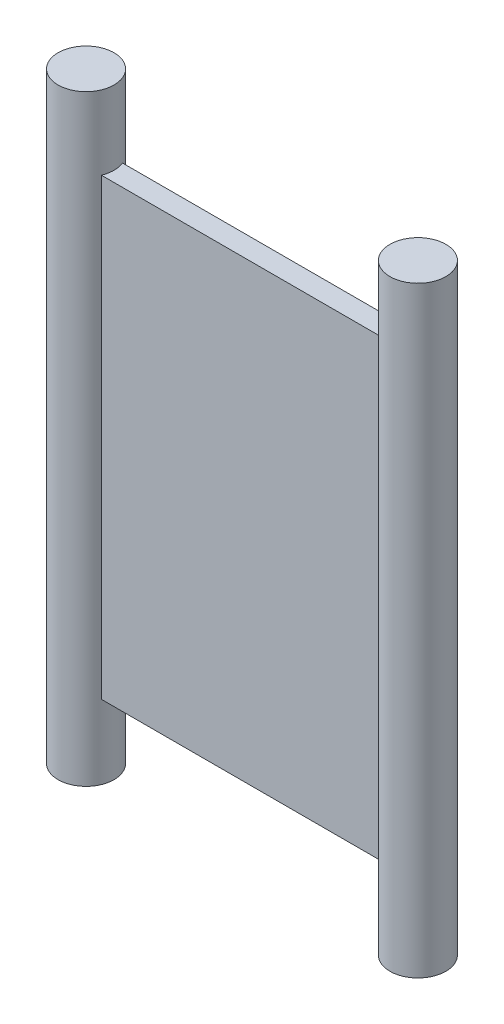
ISO-10303-21;
HEADER;
FILE_DESCRIPTION(('STEP AP214'),'2;1');
FILE_NAME('part.step','',(''),(''),'','','');
FILE_SCHEMA(('AUTOMOTIVE_DESIGN { 1 0 10303 214 1 1 1 1 }'));
ENDSEC;
DATA;
#1=APPLICATION_CONTEXT('core data for automotive mechanical design processes');
#2=APPLICATION_PROTOCOL_DEFINITION('international standard','automotive_design',2000,#1);
#3=PRODUCT_CONTEXT('',#1,'mechanical');
#4=PRODUCT('Part','Part','',(#3));
#5=PRODUCT_RELATED_PRODUCT_CATEGORY('part','',(#4));
#6=PRODUCT_DEFINITION_FORMATION('','',#4);
#7=PRODUCT_DEFINITION_CONTEXT('part definition',#1,'design');
#8=PRODUCT_DEFINITION('design','',#6,#7);
#9=PRODUCT_DEFINITION_SHAPE('','',#8);
#10=(LENGTH_UNIT() NAMED_UNIT(*) SI_UNIT(.MILLI.,.METRE.));
#11=(NAMED_UNIT(*) PLANE_ANGLE_UNIT() SI_UNIT($,.RADIAN.));
#12=(NAMED_UNIT(*) SI_UNIT($,.STERADIAN.) SOLID_ANGLE_UNIT());
#13=UNCERTAINTY_MEASURE_WITH_UNIT(LENGTH_MEASURE(1.E-05),#10,'distance_accuracy_value','');
#14=(GEOMETRIC_REPRESENTATION_CONTEXT(3) GLOBAL_UNCERTAINTY_ASSIGNED_CONTEXT((#13)) GLOBAL_UNIT_ASSIGNED_CONTEXT((#10,
#11,#12)) REPRESENTATION_CONTEXT('',''));
#15=CARTESIAN_POINT('',(0.,0.,0.));
#16=DIRECTION('',(0.,0.,1.));
#17=DIRECTION('',(1.,0.,0.));
#18=AXIS2_PLACEMENT_3D('',#15,#16,#17);
#19=CARTESIAN_POINT('',(7.86,21.5,0.499999999999999));
#20=DIRECTION('',(0.,0.,-1.));
#21=DIRECTION('',(-1.,0.,0.));
#22=AXIS2_PLACEMENT_3D('',#19,#20,#21);
#23=PLANE('',#22);
#24=DIRECTION('',(0.,-1.,0.));
#25=VECTOR('',#24,1.);
#26=CARTESIAN_POINT('',(6.6329608808192,25.,0.499999999999999));
#27=LINE('',#26,#25);
#28=CARTESIAN_POINT('',(6.6329608808192,21.5,0.499999999999999));
#29=VERTEX_POINT('',#28);
#30=CARTESIAN_POINT('',(6.6329608808192,0.,0.499999999999999));
#31=VERTEX_POINT('',#30);
#32=EDGE_CURVE('E53',#29,#31,#27,.T.);
#33=ORIENTED_EDGE('',*,*,#32,.F.);
#34=DIRECTION('',(1.,0.,0.));
#35=VECTOR('',#34,1.);
#36=CARTESIAN_POINT('',(7.86,21.5,0.499999999999999));
#37=LINE('',#36,#35);
#38=CARTESIAN_POINT('',(-6.6329608808192,21.5,0.500000000000001));
#39=VERTEX_POINT('',#38);
#40=EDGE_CURVE('E90',#39,#29,#37,.T.);
#41=ORIENTED_EDGE('',*,*,#40,.F.);
#42=DIRECTION('',(0.,-1.,0.));
#43=VECTOR('',#42,1.);
#44=CARTESIAN_POINT('',(-6.6329608808192,25.,0.500000000000001));
#45=LINE('',#44,#43);
#46=CARTESIAN_POINT('',(-6.6329608808192,0.,0.500000000000001));
#47=VERTEX_POINT('',#46);
#48=EDGE_CURVE('E103',#47,#39,#45,.F.);
#49=ORIENTED_EDGE('',*,*,#48,.F.);
#50=DIRECTION('',(1.,0.,0.));
#51=VECTOR('',#50,1.);
#52=CARTESIAN_POINT('',(7.86,0.,0.499999999999999));
#53=LINE('',#52,#51);
#54=EDGE_CURVE('E91',#47,#31,#53,.T.);
#55=ORIENTED_EDGE('',*,*,#54,.T.);
#56=EDGE_LOOP('',(#33,#41,#49,#55));
#57=FACE_BOUND('',#56,.T.);
#58=ADVANCED_FACE('F39',(#57),#23,.F.);
#59=CARTESIAN_POINT('',(7.86,21.5,-0.500000000000001));
#60=DIRECTION('',(0.,0.,1.));
#61=DIRECTION('',(1.,0.,0.));
#62=AXIS2_PLACEMENT_3D('',#59,#60,#61);
#63=PLANE('',#62);
#64=DIRECTION('',(0.,-1.,0.));
#65=VECTOR('',#64,1.);
#66=CARTESIAN_POINT('',(6.6329608808192,25.,-0.500000000000001));
#67=LINE('',#66,#65);
#68=CARTESIAN_POINT('',(6.6329608808192,0.,-0.500000000000001));
#69=VERTEX_POINT('',#68);
#70=CARTESIAN_POINT('',(6.6329608808192,21.5,-0.500000000000001));
#71=VERTEX_POINT('',#70);
#72=EDGE_CURVE('E78',#69,#71,#67,.F.);
#73=ORIENTED_EDGE('',*,*,#72,.F.);
#74=DIRECTION('',(-1.,0.,0.));
#75=VECTOR('',#74,1.);
#76=CARTESIAN_POINT('',(7.86,0.,-0.500000000000001));
#77=LINE('',#76,#75);
#78=CARTESIAN_POINT('',(-6.63296088081919,0.,-0.499999999999999));
#79=VERTEX_POINT('',#78);
#80=EDGE_CURVE('E60',#69,#79,#77,.T.);
#81=ORIENTED_EDGE('',*,*,#80,.T.);
#82=DIRECTION('',(0.,-1.,0.));
#83=VECTOR('',#82,1.);
#84=CARTESIAN_POINT('',(-6.63296088081919,25.,-0.499999999999999));
#85=LINE('',#84,#83);
#86=CARTESIAN_POINT('',(-6.63296088081919,21.5,-0.499999999999999));
#87=VERTEX_POINT('',#86);
#88=EDGE_CURVE('E105',#87,#79,#85,.T.);
#89=ORIENTED_EDGE('',*,*,#88,.F.);
#90=DIRECTION('',(-1.,0.,0.));
#91=VECTOR('',#90,1.);
#92=CARTESIAN_POINT('',(7.86,21.5,-0.500000000000001));
#93=LINE('',#92,#91);
#94=EDGE_CURVE('E85',#71,#87,#93,.T.);
#95=ORIENTED_EDGE('',*,*,#94,.F.);
#96=EDGE_LOOP('',(#73,#81,#89,#95));
#97=FACE_BOUND('',#96,.T.);
#98=ADVANCED_FACE('F84',(#97),#63,.F.);
#99=CARTESIAN_POINT('',(-7.86,25.,0.));
#100=DIRECTION('',(0.,-1.,0.));
#101=DIRECTION('',(0.,0.,-1.));
#102=AXIS2_PLACEMENT_3D('',#99,#100,#101);
#103=CYLINDRICAL_SURFACE('',#102,1.325);
#104=CARTESIAN_POINT('',(-7.86,25.,0.));
#105=DIRECTION('',(0.,1.,0.));
#106=DIRECTION('',(0.,0.,1.));
#107=AXIS2_PLACEMENT_3D('',#104,#105,#106);
#108=CIRCLE('',#107,1.325);
#109=CARTESIAN_POINT('',(-7.86,25.,1.325));
#110=VERTEX_POINT('',#109);
#111=EDGE_CURVE('E107',#110,#110,#108,.T.);
#112=ORIENTED_EDGE('',*,*,#111,.F.);
#113=EDGE_LOOP('',(#112));
#114=FACE_BOUND('',#113,.T.);
#115=CARTESIAN_POINT('',(-7.86,-3.5,0.));
#116=DIRECTION('',(0.,1.,0.));
#117=DIRECTION('',(0.,0.,1.));
#118=AXIS2_PLACEMENT_3D('',#115,#116,#117);
#119=CIRCLE('',#118,1.325);
#120=CARTESIAN_POINT('',(-7.86,-3.5,1.325));
#121=VERTEX_POINT('',#120);
#122=EDGE_CURVE('E108',#121,#121,#119,.T.);
#123=ORIENTED_EDGE('',*,*,#122,.T.);
#124=EDGE_LOOP('',(#123));
#125=FACE_BOUND('',#124,.T.);
#126=ORIENTED_EDGE('',*,*,#48,.T.);
#127=CARTESIAN_POINT('',(-7.86,21.5,0.));
#128=DIRECTION('',(0.,-1.,0.));
#129=DIRECTION('',(0.,0.,-1.));
#130=AXIS2_PLACEMENT_3D('',#127,#128,#129);
#131=CIRCLE('',#130,1.325);
#132=EDGE_CURVE('E95',#39,#87,#131,.F.);
#133=ORIENTED_EDGE('',*,*,#132,.T.);
#134=ORIENTED_EDGE('',*,*,#88,.T.);
#135=CARTESIAN_POINT('',(-7.86,0.,0.));
#136=DIRECTION('',(0.,-1.,0.));
#137=DIRECTION('',(0.,0.,-1.));
#138=AXIS2_PLACEMENT_3D('',#135,#136,#137);
#139=CIRCLE('',#138,1.325);
#140=EDGE_CURVE('E46',#47,#79,#139,.F.);
#141=ORIENTED_EDGE('',*,*,#140,.F.);
#142=EDGE_LOOP('',(#126,#133,#134,#141));
#143=FACE_BOUND('',#142,.T.);
#144=ADVANCED_FACE('F138',(#114,#125,#143),#103,.T.);
#145=CARTESIAN_POINT('',(-7.86,25.,0.));
#146=DIRECTION('',(0.,1.,0.));
#147=DIRECTION('',(0.,0.,1.));
#148=AXIS2_PLACEMENT_3D('',#145,#146,#147);
#149=PLANE('',#148);
#150=ORIENTED_EDGE('',*,*,#111,.T.);
#151=EDGE_LOOP('',(#150));
#152=FACE_BOUND('',#151,.T.);
#153=ADVANCED_FACE('F144',(#152),#149,.T.);
#154=CARTESIAN_POINT('',(-7.86,-3.5,0.));
#155=DIRECTION('',(0.,1.,0.));
#156=DIRECTION('',(0.,0.,1.));
#157=AXIS2_PLACEMENT_3D('',#154,#155,#156);
#158=PLANE('',#157);
#159=ORIENTED_EDGE('',*,*,#122,.F.);
#160=EDGE_LOOP('',(#159));
#161=FACE_BOUND('',#160,.T.);
#162=ADVANCED_FACE('F150',(#161),#158,.F.);
#163=CARTESIAN_POINT('',(0.,21.5,0.));
#164=DIRECTION('',(0.,-1.,0.));
#165=DIRECTION('',(0.,0.,-1.));
#166=AXIS2_PLACEMENT_3D('',#163,#164,#165);
#167=PLANE('',#166);
#168=CARTESIAN_POINT('',(7.86,21.5,0.));
#169=DIRECTION('',(0.,-1.,0.));
#170=DIRECTION('',(0.,0.,-1.));
#171=AXIS2_PLACEMENT_3D('',#168,#169,#170);
#172=CIRCLE('',#171,1.325);
#173=EDGE_CURVE('E111',#71,#29,#172,.F.);
#174=ORIENTED_EDGE('',*,*,#173,.F.);
#175=ORIENTED_EDGE('',*,*,#94,.T.);
#176=ORIENTED_EDGE('',*,*,#132,.F.);
#177=ORIENTED_EDGE('',*,*,#40,.T.);
#178=EDGE_LOOP('',(#174,#175,#176,#177));
#179=FACE_BOUND('',#178,.T.);
#180=ADVANCED_FACE('F141',(#179),#167,.F.);
#181=CARTESIAN_POINT('',(0.,0.,0.));
#182=DIRECTION('',(0.,-1.,0.));
#183=DIRECTION('',(0.,0.,-1.));
#184=AXIS2_PLACEMENT_3D('',#181,#182,#183);
#185=PLANE('',#184);
#186=ORIENTED_EDGE('',*,*,#80,.F.);
#187=CARTESIAN_POINT('',(7.86,0.,0.));
#188=DIRECTION('',(0.,-1.,0.));
#189=DIRECTION('',(0.,0.,-1.));
#190=AXIS2_PLACEMENT_3D('',#187,#188,#189);
#191=CIRCLE('',#190,1.325);
#192=EDGE_CURVE('E11',#69,#31,#191,.F.);
#193=ORIENTED_EDGE('',*,*,#192,.T.);
#194=ORIENTED_EDGE('',*,*,#54,.F.);
#195=ORIENTED_EDGE('',*,*,#140,.T.);
#196=EDGE_LOOP('',(#186,#193,#194,#195));
#197=FACE_BOUND('',#196,.T.);
#198=ADVANCED_FACE('F89',(#197),#185,.T.);
#199=CARTESIAN_POINT('',(7.86,25.,0.));
#200=DIRECTION('',(0.,-1.,0.));
#201=DIRECTION('',(0.,0.,-1.));
#202=AXIS2_PLACEMENT_3D('',#199,#200,#201);
#203=CYLINDRICAL_SURFACE('',#202,1.325);
#204=CARTESIAN_POINT('',(7.86,25.,0.));
#205=DIRECTION('',(0.,1.,0.));
#206=DIRECTION('',(0.,0.,1.));
#207=AXIS2_PLACEMENT_3D('',#204,#205,#206);
#208=CIRCLE('',#207,1.325);
#209=CARTESIAN_POINT('',(7.86,25.,1.325));
#210=VERTEX_POINT('',#209);
#211=EDGE_CURVE('E116',#210,#210,#208,.T.);
#212=ORIENTED_EDGE('',*,*,#211,.F.);
#213=EDGE_LOOP('',(#212));
#214=FACE_BOUND('',#213,.T.);
#215=CARTESIAN_POINT('',(7.86,-3.5,0.));
#216=DIRECTION('',(0.,1.,0.));
#217=DIRECTION('',(0.,0.,1.));
#218=AXIS2_PLACEMENT_3D('',#215,#216,#217);
#219=CIRCLE('',#218,1.325);
#220=CARTESIAN_POINT('',(7.86,-3.5,1.325));
#221=VERTEX_POINT('',#220);
#222=EDGE_CURVE('E86',#221,#221,#219,.T.);
#223=ORIENTED_EDGE('',*,*,#222,.T.);
#224=EDGE_LOOP('',(#223));
#225=FACE_BOUND('',#224,.T.);
#226=ORIENTED_EDGE('',*,*,#72,.T.);
#227=ORIENTED_EDGE('',*,*,#173,.T.);
#228=ORIENTED_EDGE('',*,*,#32,.T.);
#229=ORIENTED_EDGE('',*,*,#192,.F.);
#230=EDGE_LOOP('',(#226,#227,#228,#229));
#231=FACE_BOUND('',#230,.T.);
#232=ADVANCED_FACE('F77',(#214,#225,#231),#203,.T.);
#233=CARTESIAN_POINT('',(7.86,25.,0.));
#234=DIRECTION('',(0.,1.,0.));
#235=DIRECTION('',(0.,0.,1.));
#236=AXIS2_PLACEMENT_3D('',#233,#234,#235);
#237=PLANE('',#236);
#238=ORIENTED_EDGE('',*,*,#211,.T.);
#239=EDGE_LOOP('',(#238));
#240=FACE_BOUND('',#239,.T.);
#241=ADVANCED_FACE('F125',(#240),#237,.T.);
#242=CARTESIAN_POINT('',(7.86,-3.5,0.));
#243=DIRECTION('',(0.,1.,0.));
#244=DIRECTION('',(0.,0.,1.));
#245=AXIS2_PLACEMENT_3D('',#242,#243,#244);
#246=PLANE('',#245);
#247=ORIENTED_EDGE('',*,*,#222,.F.);
#248=EDGE_LOOP('',(#247));
#249=FACE_BOUND('',#248,.T.);
#250=ADVANCED_FACE('F123',(#249),#246,.F.);
#251=CLOSED_SHELL('',(#58,#98,#144,#153,#162,#180,#198,#232,#241,#250));
#252=MANIFOLD_SOLID_BREP('B2',#251);
#253=ADVANCED_BREP_SHAPE_REPRESENTATION('',(#18,#252),#14);
#254=SHAPE_DEFINITION_REPRESENTATION(#9,#253);
ENDSEC;
END-ISO-10303-21;
